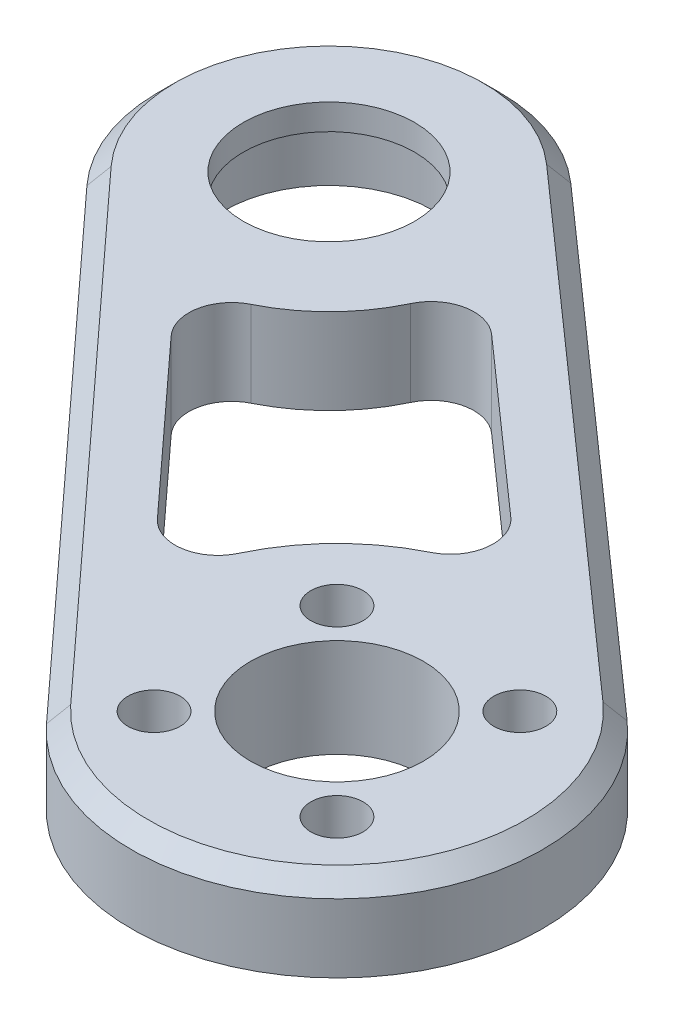
ISO-10303-21;
HEADER;
FILE_DESCRIPTION(('STEP AP214'),'2;1');
FILE_NAME('part.step','',(''),(''),'','','');
FILE_SCHEMA(('AUTOMOTIVE_DESIGN { 1 0 10303 214 1 1 1 1 }'));
ENDSEC;
DATA;
#1=APPLICATION_CONTEXT('core data for automotive mechanical design processes');
#2=APPLICATION_PROTOCOL_DEFINITION('international standard','automotive_design',2000,#1);
#3=PRODUCT_CONTEXT('',#1,'mechanical');
#4=PRODUCT('Part','Part','',(#3));
#5=PRODUCT_RELATED_PRODUCT_CATEGORY('part','',(#4));
#6=PRODUCT_DEFINITION_FORMATION('','',#4);
#7=PRODUCT_DEFINITION_CONTEXT('part definition',#1,'design');
#8=PRODUCT_DEFINITION('design','',#6,#7);
#9=PRODUCT_DEFINITION_SHAPE('','',#8);
#10=(LENGTH_UNIT() NAMED_UNIT(*) SI_UNIT(.MILLI.,.METRE.));
#11=(NAMED_UNIT(*) PLANE_ANGLE_UNIT() SI_UNIT($,.RADIAN.));
#12=(NAMED_UNIT(*) SI_UNIT($,.STERADIAN.) SOLID_ANGLE_UNIT());
#13=UNCERTAINTY_MEASURE_WITH_UNIT(LENGTH_MEASURE(1.E-05),#10,'distance_accuracy_value','');
#14=(GEOMETRIC_REPRESENTATION_CONTEXT(3) GLOBAL_UNCERTAINTY_ASSIGNED_CONTEXT((#13)) GLOBAL_UNIT_ASSIGNED_CONTEXT((#10,
#11,#12)) REPRESENTATION_CONTEXT('',''));
#15=CARTESIAN_POINT('',(0.,0.,0.));
#16=DIRECTION('',(0.,0.,1.));
#17=DIRECTION('',(1.,0.,0.));
#18=AXIS2_PLACEMENT_3D('',#15,#16,#17);
#19=CARTESIAN_POINT('',(-55.,10.,-54.067232451828));
#20=DIRECTION('',(0.,-1.,0.));
#21=DIRECTION('',(0.,0.,-1.));
#22=AXIS2_PLACEMENT_3D('',#19,#20,#21);
#23=CYLINDRICAL_SURFACE('',#22,10.);
#24=CARTESIAN_POINT('',(-55.,10.,-54.067232451828));
#25=DIRECTION('',(0.,1.,0.));
#26=DIRECTION('',(0.,0.,1.));
#27=AXIS2_PLACEMENT_3D('',#24,#25,#26);
#28=CIRCLE('',#27,10.);
#29=CARTESIAN_POINT('',(-55.,10.,-44.067232451828));
#30=VERTEX_POINT('',#29);
#31=EDGE_CURVE('E172',#30,#30,#28,.T.);
#32=ORIENTED_EDGE('',*,*,#31,.T.);
#33=EDGE_LOOP('',(#32));
#34=FACE_BOUND('',#33,.T.);
#35=CARTESIAN_POINT('',(-55.,7.,-54.067232451828));
#36=DIRECTION('',(0.,-1.,0.));
#37=DIRECTION('',(0.,0.,-1.));
#38=AXIS2_PLACEMENT_3D('',#35,#36,#37);
#39=CIRCLE('',#38,10.);
#40=CARTESIAN_POINT('',(-55.,7.,-64.067232451828));
#41=VERTEX_POINT('',#40);
#42=EDGE_CURVE('E201',#41,#41,#39,.T.);
#43=ORIENTED_EDGE('',*,*,#42,.T.);
#44=EDGE_LOOP('',(#43));
#45=FACE_BOUND('',#44,.T.);
#46=ADVANCED_FACE('F50',(#34,#45),#23,.F.);
#47=CARTESIAN_POINT('',(-55.,10.,-54.067232451828));
#48=DIRECTION('',(0.,-1.,0.));
#49=DIRECTION('',(0.,0.,-1.));
#50=AXIS2_PLACEMENT_3D('',#47,#48,#49);
#51=PLANE('',#50);
#52=DIRECTION('',(0.675809968436696,0.,0.737075902849626));
#53=VECTOR('',#52,1.);
#54=CARTESIAN_POINT('',(-68.2673662512933,10.,-41.9026530199674));
#55=LINE('',#54,#53);
#56=CARTESIAN_POINT('',(-68.2673662512933,10.,-41.9026530199674));
#57=VERTEX_POINT('',#56);
#58=CARTESIAN_POINT('',(-16.2156698626918,10.,14.8678193056074));
#59=VERTEX_POINT('',#58);
#60=EDGE_CURVE('E292',#57,#59,#55,.T.);
#61=ORIENTED_EDGE('',*,*,#60,.T.);
#62=CARTESIAN_POINT('',(0.,10.,0.));
#63=DIRECTION('',(0.,-1.,0.));
#64=DIRECTION('',(0.,0.,-1.));
#65=AXIS2_PLACEMENT_3D('',#62,#63,#64);
#66=CIRCLE('',#65,22.0000000000001);
#67=CARTESIAN_POINT('',(14.5883047431323,10.,-16.4675852729387));
#68=VERTEX_POINT('',#67);
#69=EDGE_CURVE('E300',#59,#68,#66,.F.);
#70=ORIENTED_EDGE('',*,*,#69,.T.);
#71=DIRECTION('',(-0.748526603315393,0.,-0.663104761051465));
#72=VECTOR('',#71,1.);
#73=CARTESIAN_POINT('',(-43.0641143010736,10.,-67.5407113115051));
#74=LINE('',#73,#72);
#75=CARTESIAN_POINT('',(-43.0641143010736,10.,-67.5407113115051));
#76=VERTEX_POINT('',#75);
#77=EDGE_CURVE('E294',#68,#76,#74,.T.);
#78=ORIENTED_EDGE('',*,*,#77,.T.);
#79=CARTESIAN_POINT('',(-55.,10.,-54.067232451828));
#80=DIRECTION('',(0.,-1.,0.));
#81=DIRECTION('',(0.,0.,-1.));
#82=AXIS2_PLACEMENT_3D('',#79,#80,#81);
#83=CIRCLE('',#82,18.);
#84=EDGE_CURVE('E286',#76,#57,#83,.F.);
#85=ORIENTED_EDGE('',*,*,#84,.T.);
#86=EDGE_LOOP('',(#61,#70,#78,#85));
#87=FACE_BOUND('',#86,.T.);
#88=CARTESIAN_POINT('',(-10.677312395917,10.,-10.6773123959167));
#89=DIRECTION('',(0.,-1.,0.));
#90=DIRECTION('',(0.,0.,-1.));
#91=AXIS2_PLACEMENT_3D('',#88,#89,#90);
#92=CIRCLE('',#91,3.05);
#93=CARTESIAN_POINT('',(-10.677312395917,10.,-13.7273123959167));
#94=VERTEX_POINT('',#93);
#95=EDGE_CURVE('E322',#94,#94,#92,.T.);
#96=ORIENTED_EDGE('',*,*,#95,.T.);
#97=EDGE_LOOP('',(#96));
#98=FACE_BOUND('',#97,.T.);
#99=CARTESIAN_POINT('',(10.6773123959168,10.,-10.677312395917));
#100=DIRECTION('',(0.,-1.,0.));
#101=DIRECTION('',(0.,0.,-1.));
#102=AXIS2_PLACEMENT_3D('',#99,#100,#101);
#103=CIRCLE('',#102,3.05);
#104=CARTESIAN_POINT('',(10.6773123959168,10.,-13.727312395917));
#105=VERTEX_POINT('',#104);
#106=EDGE_CURVE('E337',#105,#105,#103,.T.);
#107=ORIENTED_EDGE('',*,*,#106,.T.);
#108=EDGE_LOOP('',(#107));
#109=FACE_BOUND('',#108,.T.);
#110=CARTESIAN_POINT('',(10.6773123959169,10.,10.6773123959168));
#111=DIRECTION('',(0.,-1.,0.));
#112=DIRECTION('',(0.,0.,-1.));
#113=AXIS2_PLACEMENT_3D('',#110,#111,#112);
#114=CIRCLE('',#113,3.05);
#115=CARTESIAN_POINT('',(10.6773123959169,10.,7.62731239591681));
#116=VERTEX_POINT('',#115);
#117=EDGE_CURVE('E482',#116,#116,#114,.T.);
#118=ORIENTED_EDGE('',*,*,#117,.T.);
#119=EDGE_LOOP('',(#118));
#120=FACE_BOUND('',#119,.T.);
#121=CARTESIAN_POINT('',(-10.6773123959169,10.,10.6773123959169));
#122=DIRECTION('',(0.,-1.,0.));
#123=DIRECTION('',(0.,0.,-1.));
#124=AXIS2_PLACEMENT_3D('',#121,#122,#123);
#125=CIRCLE('',#124,3.05);
#126=CARTESIAN_POINT('',(-10.6773123959169,10.,7.62731239591688));
#127=VERTEX_POINT('',#126);
#128=EDGE_CURVE('E336',#127,#127,#125,.T.);
#129=ORIENTED_EDGE('',*,*,#128,.T.);
#130=EDGE_LOOP('',(#129));
#131=FACE_BOUND('',#130,.T.);
#132=ORIENTED_EDGE('',*,*,#31,.F.);
#133=EDGE_LOOP('',(#132));
#134=FACE_BOUND('',#133,.T.);
#135=CARTESIAN_POINT('',(0.,10.,0.));
#136=DIRECTION('',(0.,1.,0.));
#137=DIRECTION('',(0.,0.,1.));
#138=AXIS2_PLACEMENT_3D('',#135,#136,#137);
#139=CIRCLE('',#138,10.1);
#140=CARTESIAN_POINT('',(0.,10.,10.1));
#141=VERTEX_POINT('',#140);
#142=EDGE_CURVE('E253',#141,#141,#139,.T.);
#143=ORIENTED_EDGE('',*,*,#142,.F.);
#144=EDGE_LOOP('',(#143));
#145=FACE_BOUND('',#144,.T.);
#146=CARTESIAN_POINT('',(-26.2417192829032,10.,-12.3439122273819));
#147=DIRECTION('',(0.,1.,0.));
#148=DIRECTION('',(0.,0.,1.));
#149=AXIS2_PLACEMENT_3D('',#146,#147,#148);
#150=CIRCLE('',#149,5.);
#151=CARTESIAN_POINT('',(-29.9270987971513,10.,-8.96486238519837));
#152=VERTEX_POINT('',#151);
#153=CARTESIAN_POINT('',(-21.7172849237819,10.,-10.2156514985229));
#154=VERTEX_POINT('',#153);
#155=EDGE_CURVE('E151',#152,#154,#150,.T.);
#156=ORIENTED_EDGE('',*,*,#155,.F.);
#157=DIRECTION('',(0.675809968436696,0.,0.737075902849626));
#158=VECTOR('',#157,1.);
#159=CARTESIAN_POINT('',(-47.6254715917148,10.,-28.2676911621966));
#160=LINE('',#159,#158);
#161=CARTESIAN_POINT('',(-47.6254715917148,10.,-28.2676911621966));
#162=VERTEX_POINT('',#161);
#163=EDGE_CURVE('E197',#162,#152,#160,.T.);
#164=ORIENTED_EDGE('',*,*,#163,.F.);
#165=CARTESIAN_POINT('',(-43.9400920774667,10.,-31.6467410043801));
#166=DIRECTION('',(0.,1.,0.));
#167=DIRECTION('',(0.,0.,-1.));
#168=AXIS2_PLACEMENT_3D('',#165,#166,#167);
#169=CIRCLE('',#168,5.);
#170=CARTESIAN_POINT('',(-46.1520736619733,10.,-36.1308392938697));
#171=VERTEX_POINT('',#170);
#172=EDGE_CURVE('E191',#171,#162,#169,.T.);
#173=ORIENTED_EDGE('',*,*,#172,.F.);
#174=CARTESIAN_POINT('',(-55.0000000000002,10.,-54.0672324518282));
#175=DIRECTION('',(0.,-1.,0.));
#176=DIRECTION('',(0.,0.,1.));
#177=AXIS2_PLACEMENT_3D('',#174,#175,#176);
#178=CIRCLE('',#177,20.0000000000003);
#179=CARTESIAN_POINT('',(-36.9149025544563,10.,-45.527370018206));
#180=VERTEX_POINT('',#179);
#181=EDGE_CURVE('E186',#180,#171,#178,.T.);
#182=ORIENTED_EDGE('',*,*,#181,.F.);
#183=CARTESIAN_POINT('',(-32.3936281930703,10.,-43.3924044098006));
#184=DIRECTION('',(0.,1.,0.));
#185=DIRECTION('',(0.,0.,1.));
#186=AXIS2_PLACEMENT_3D('',#183,#184,#185);
#187=CIRCLE('',#186,5.);
#188=CARTESIAN_POINT('',(-29.078104387813,10.,-47.1350374263775));
#189=VERTEX_POINT('',#188);
#190=EDGE_CURVE('E190',#189,#180,#187,.T.);
#191=ORIENTED_EDGE('',*,*,#190,.F.);
#192=DIRECTION('',(-0.748526603315393,0.,-0.663104761051465));
#193=VECTOR('',#192,1.);
#194=CARTESIAN_POINT('',(-29.078104387813,10.,-47.1350374263775));
#195=LINE('',#194,#193);
#196=CARTESIAN_POINT('',(-9.47540023893942,10.,-29.7693935160243));
#197=VERTEX_POINT('',#196);
#198=EDGE_CURVE('E182',#197,#189,#195,.T.);
#199=ORIENTED_EDGE('',*,*,#198,.F.);
#200=CARTESIAN_POINT('',(-12.7909240441967,10.,-26.0267604994473));
#201=DIRECTION('',(0.,1.,0.));
#202=DIRECTION('',(0.,0.,-1.));
#203=AXIS2_PLACEMENT_3D('',#200,#201,#202);
#204=CIRCLE('',#203,5.);
#205=CARTESIAN_POINT('',(-10.5855923124387,10.,-21.5393879995426));
#206=VERTEX_POINT('',#205);
#207=EDGE_CURVE('E180',#206,#197,#204,.T.);
#208=ORIENTED_EDGE('',*,*,#207,.F.);
#209=CARTESIAN_POINT('',(8.96852037080009E-13,10.,8.77770078844264E-13));
#210=DIRECTION('',(0.,-1.,0.));
#211=DIRECTION('',(0.,0.,-1.));
#212=AXIS2_PLACEMENT_3D('',#209,#210,#211);
#213=CIRCLE('',#212,24.0000000000012);
#214=EDGE_CURVE('E165',#154,#206,#213,.T.);
#215=ORIENTED_EDGE('',*,*,#214,.F.);
#216=EDGE_LOOP('',(#156,#164,#173,#182,#191,#199,#208,#215));
#217=FACE_BOUND('',#216,.T.);
#218=ADVANCED_FACE('F171',(#87,#98,#109,#120,#131,#134,#145,#217),#51,.F.);
#219=CARTESIAN_POINT('',(-55.,0.,-54.067232451828));
#220=DIRECTION('',(0.,-1.,0.));
#221=DIRECTION('',(0.,0.,-1.));
#222=AXIS2_PLACEMENT_3D('',#219,#220,#221);
#223=PLANE('',#222);
#224=CARTESIAN_POINT('',(0.,0.,0.));
#225=DIRECTION('',(0.,-1.,0.));
#226=DIRECTION('',(0.,0.,-1.));
#227=AXIS2_PLACEMENT_3D('',#224,#225,#226);
#228=CIRCLE('',#227,21.5);
#229=CARTESIAN_POINT('',(0.,0.,-21.5));
#230=VERTEX_POINT('',#229);
#231=EDGE_CURVE('E283',#230,#230,#228,.T.);
#232=ORIENTED_EDGE('',*,*,#231,.F.);
#233=EDGE_LOOP('',(#232));
#234=FACE_BOUND('',#233,.T.);
#235=CARTESIAN_POINT('',(-55.,0.,-54.067232451828));
#236=DIRECTION('',(0.,-1.,0.));
#237=DIRECTION('',(0.,0.,-1.));
#238=AXIS2_PLACEMENT_3D('',#235,#236,#237);
#239=CIRCLE('',#238,12.2);
#240=CARTESIAN_POINT('',(-55.,0.,-66.267232451828));
#241=VERTEX_POINT('',#240);
#242=EDGE_CURVE('E360',#241,#241,#239,.T.);
#243=ORIENTED_EDGE('',*,*,#242,.F.);
#244=EDGE_LOOP('',(#243));
#245=FACE_BOUND('',#244,.T.);
#246=CARTESIAN_POINT('',(-55.,0.,-54.067232451828));
#247=DIRECTION('',(0.,1.,0.));
#248=DIRECTION('',(0.,0.,-1.));
#249=AXIS2_PLACEMENT_3D('',#246,#247,#248);
#250=CIRCLE('',#249,20.);
#251=CARTESIAN_POINT('',(-41.7379047789707,0.,-69.0377645181358));
#252=VERTEX_POINT('',#251);
#253=CARTESIAN_POINT('',(-69.7415180569925,0.,-40.5510330830941));
#254=VERTEX_POINT('',#253);
#255=EDGE_CURVE('E254',#252,#254,#250,.T.);
#256=ORIENTED_EDGE('',*,*,#255,.F.);
#257=DIRECTION('',(-0.748526603315393,0.,-0.663104761051465));
#258=VECTOR('',#257,1.);
#259=CARTESIAN_POINT('',(-41.7379047789707,0.,-69.0377645181358));
#260=LINE('',#259,#258);
#261=CARTESIAN_POINT('',(15.9145142652352,0.,-17.9646384795694));
#262=VERTEX_POINT('',#261);
#263=EDGE_CURVE('E270',#262,#252,#260,.T.);
#264=ORIENTED_EDGE('',*,*,#263,.F.);
#265=CARTESIAN_POINT('',(0.,0.,0.));
#266=DIRECTION('',(0.,1.,0.));
#267=DIRECTION('',(0.,0.,1.));
#268=AXIS2_PLACEMENT_3D('',#265,#266,#267);
#269=CIRCLE('',#268,24.);
#270=CARTESIAN_POINT('',(-17.689821668391,0.,16.2194392424807));
#271=VERTEX_POINT('',#270);
#272=EDGE_CURVE('E263',#271,#262,#269,.T.);
#273=ORIENTED_EDGE('',*,*,#272,.F.);
#274=DIRECTION('',(0.675809968436696,0.,0.737075902849626));
#275=VECTOR('',#274,1.);
#276=CARTESIAN_POINT('',(-69.7415180569925,0.,-40.5510330830941));
#277=LINE('',#276,#275);
#278=EDGE_CURVE('E259',#254,#271,#277,.T.);
#279=ORIENTED_EDGE('',*,*,#278,.F.);
#280=EDGE_LOOP('',(#256,#264,#273,#279));
#281=FACE_BOUND('',#280,.T.);
#282=DIRECTION('',(0.675809968436696,0.,0.737075902849626));
#283=VECTOR('',#282,1.);
#284=CARTESIAN_POINT('',(-47.6254715917148,0.,-28.2676911621966));
#285=LINE('',#284,#283);
#286=CARTESIAN_POINT('',(-47.6254715917148,0.,-28.2676911621966));
#287=VERTEX_POINT('',#286);
#288=CARTESIAN_POINT('',(-29.9270987971513,0.,-8.96486238519838));
#289=VERTEX_POINT('',#288);
#290=EDGE_CURVE('E162',#287,#289,#285,.T.);
#291=ORIENTED_EDGE('',*,*,#290,.T.);
#292=CARTESIAN_POINT('',(-26.2417192829032,0.,-12.3439122273819));
#293=DIRECTION('',(0.,1.,0.));
#294=DIRECTION('',(0.,0.,1.));
#295=AXIS2_PLACEMENT_3D('',#292,#293,#294);
#296=CIRCLE('',#295,5.);
#297=CARTESIAN_POINT('',(-21.7172849237819,0.,-10.2156514985229));
#298=VERTEX_POINT('',#297);
#299=EDGE_CURVE('E199',#289,#298,#296,.T.);
#300=ORIENTED_EDGE('',*,*,#299,.T.);
#301=CARTESIAN_POINT('',(8.96852037080009E-13,0.,8.77770078844264E-13));
#302=DIRECTION('',(0.,-1.,0.));
#303=DIRECTION('',(0.,0.,-1.));
#304=AXIS2_PLACEMENT_3D('',#301,#302,#303);
#305=CIRCLE('',#304,24.0000000000012);
#306=CARTESIAN_POINT('',(-10.5855923124387,0.,-21.5393879995426));
#307=VERTEX_POINT('',#306);
#308=EDGE_CURVE('E166',#298,#307,#305,.T.);
#309=ORIENTED_EDGE('',*,*,#308,.T.);
#310=CARTESIAN_POINT('',(-12.7909240441967,0.,-26.0267604994473));
#311=DIRECTION('',(0.,1.,0.));
#312=DIRECTION('',(0.,0.,-1.));
#313=AXIS2_PLACEMENT_3D('',#310,#311,#312);
#314=CIRCLE('',#313,5.);
#315=CARTESIAN_POINT('',(-9.47540023893942,0.,-29.7693935160243));
#316=VERTEX_POINT('',#315);
#317=EDGE_CURVE('E206',#307,#316,#314,.T.);
#318=ORIENTED_EDGE('',*,*,#317,.T.);
#319=DIRECTION('',(-0.748526603315393,0.,-0.663104761051465));
#320=VECTOR('',#319,1.);
#321=CARTESIAN_POINT('',(-29.078104387813,0.,-47.1350374263775));
#322=LINE('',#321,#320);
#323=CARTESIAN_POINT('',(-29.078104387813,0.,-47.1350374263775));
#324=VERTEX_POINT('',#323);
#325=EDGE_CURVE('E209',#316,#324,#322,.T.);
#326=ORIENTED_EDGE('',*,*,#325,.T.);
#327=CARTESIAN_POINT('',(-32.3936281930703,0.,-43.3924044098006));
#328=DIRECTION('',(0.,1.,0.));
#329=DIRECTION('',(0.,0.,1.));
#330=AXIS2_PLACEMENT_3D('',#327,#328,#329);
#331=CIRCLE('',#330,5.);
#332=CARTESIAN_POINT('',(-36.9149025544563,0.,-45.527370018206));
#333=VERTEX_POINT('',#332);
#334=EDGE_CURVE('E212',#324,#333,#331,.T.);
#335=ORIENTED_EDGE('',*,*,#334,.T.);
#336=CARTESIAN_POINT('',(-55.0000000000002,0.,-54.0672324518282));
#337=DIRECTION('',(0.,-1.,0.));
#338=DIRECTION('',(0.,0.,1.));
#339=AXIS2_PLACEMENT_3D('',#336,#337,#338);
#340=CIRCLE('',#339,20.0000000000003);
#341=CARTESIAN_POINT('',(-46.1520736619733,0.,-36.1308392938697));
#342=VERTEX_POINT('',#341);
#343=EDGE_CURVE('E217',#333,#342,#340,.T.);
#344=ORIENTED_EDGE('',*,*,#343,.T.);
#345=CARTESIAN_POINT('',(-43.9400920774667,0.,-31.6467410043801));
#346=DIRECTION('',(0.,1.,0.));
#347=DIRECTION('',(0.,0.,-1.));
#348=AXIS2_PLACEMENT_3D('',#345,#346,#347);
#349=CIRCLE('',#348,5.);
#350=EDGE_CURVE('E225',#342,#287,#349,.T.);
#351=ORIENTED_EDGE('',*,*,#350,.T.);
#352=EDGE_LOOP('',(#291,#300,#309,#318,#326,#335,#344,#351));
#353=FACE_BOUND('',#352,.T.);
#354=ADVANCED_FACE('F369',(#234,#245,#281,#353),#223,.T.);
#355=CARTESIAN_POINT('',(-55.,10.,-54.067232451828));
#356=DIRECTION('',(0.,-1.,0.));
#357=DIRECTION('',(0.,0.,-1.));
#358=AXIS2_PLACEMENT_3D('',#355,#356,#357);
#359=CYLINDRICAL_SURFACE('',#358,20.);
#360=DIRECTION('',(0.,-1.,0.));
#361=VECTOR('',#360,1.);
#362=CARTESIAN_POINT('',(-69.7415180569925,10.,-40.5510330830941));
#363=LINE('',#362,#361);
#364=CARTESIAN_POINT('',(-69.7415180569925,8.00000000000005,-40.5510330830941));
#365=VERTEX_POINT('',#364);
#366=EDGE_CURVE('E278',#365,#254,#363,.T.);
#367=ORIENTED_EDGE('',*,*,#366,.F.);
#368=CARTESIAN_POINT('',(-55.,8.00000000000005,-54.067232451828));
#369=DIRECTION('',(0.,-1.,0.));
#370=DIRECTION('',(0.,0.,-1.));
#371=AXIS2_PLACEMENT_3D('',#368,#369,#370);
#372=CIRCLE('',#371,20.);
#373=CARTESIAN_POINT('',(-41.7379047789707,8.00000000000005,-69.0377645181358));
#374=VERTEX_POINT('',#373);
#375=EDGE_CURVE('E11',#365,#374,#372,.T.);
#376=ORIENTED_EDGE('',*,*,#375,.T.);
#377=DIRECTION('',(0.,-1.,0.));
#378=VECTOR('',#377,1.);
#379=CARTESIAN_POINT('',(-41.7379047789707,10.,-69.0377645181358));
#380=LINE('',#379,#378);
#381=EDGE_CURVE('E271',#374,#252,#380,.T.);
#382=ORIENTED_EDGE('',*,*,#381,.T.);
#383=ORIENTED_EDGE('',*,*,#255,.T.);
#384=EDGE_LOOP('',(#367,#376,#382,#383));
#385=FACE_BOUND('',#384,.T.);
#386=ADVANCED_FACE('F375',(#385),#359,.T.);
#387=CARTESIAN_POINT('',(-69.7415180569925,10.,-40.5510330830941));
#388=DIRECTION('',(0.737075902849626,0.,-0.675809968436696));
#389=DIRECTION('',(-0.675809968436696,0.,-0.737075902849626));
#390=AXIS2_PLACEMENT_3D('',#387,#388,#389);
#391=PLANE('',#390);
#392=DIRECTION('',(0.,-1.,0.));
#393=VECTOR('',#392,1.);
#394=CARTESIAN_POINT('',(-17.689821668391,10.,16.2194392424807));
#395=LINE('',#394,#393);
#396=CARTESIAN_POINT('',(-17.689821668391,8.00000000000005,16.2194392424807));
#397=VERTEX_POINT('',#396);
#398=EDGE_CURVE('E280',#397,#271,#395,.T.);
#399=ORIENTED_EDGE('',*,*,#398,.F.);
#400=DIRECTION('',(-0.675809968436696,0.,-0.737075902849626));
#401=VECTOR('',#400,1.);
#402=CARTESIAN_POINT('',(-69.7415180569925,8.00000000000005,-40.5510330830941));
#403=LINE('',#402,#401);
#404=EDGE_CURVE('E59',#397,#365,#403,.T.);
#405=ORIENTED_EDGE('',*,*,#404,.T.);
#406=ORIENTED_EDGE('',*,*,#366,.T.);
#407=ORIENTED_EDGE('',*,*,#278,.T.);
#408=EDGE_LOOP('',(#399,#405,#406,#407));
#409=FACE_BOUND('',#408,.T.);
#410=ADVANCED_FACE('F436',(#409),#391,.F.);
#411=CARTESIAN_POINT('',(0.,10.,0.));
#412=DIRECTION('',(0.,-1.,0.));
#413=DIRECTION('',(0.,0.,-1.));
#414=AXIS2_PLACEMENT_3D('',#411,#412,#413);
#415=CYLINDRICAL_SURFACE('',#414,24.);
#416=DIRECTION('',(0.,-1.,0.));
#417=VECTOR('',#416,1.);
#418=CARTESIAN_POINT('',(15.9145142652352,10.,-17.9646384795694));
#419=LINE('',#418,#417);
#420=CARTESIAN_POINT('',(15.9145142652352,8.00000000000005,-17.9646384795694));
#421=VERTEX_POINT('',#420);
#422=EDGE_CURVE('E273',#421,#262,#419,.T.);
#423=ORIENTED_EDGE('',*,*,#422,.F.);
#424=CARTESIAN_POINT('',(0.,8.00000000000005,0.));
#425=DIRECTION('',(0.,-1.,0.));
#426=DIRECTION('',(0.,0.,-1.));
#427=AXIS2_PLACEMENT_3D('',#424,#425,#426);
#428=CIRCLE('',#427,24.);
#429=EDGE_CURVE('E303',#421,#397,#428,.T.);
#430=ORIENTED_EDGE('',*,*,#429,.T.);
#431=ORIENTED_EDGE('',*,*,#398,.T.);
#432=ORIENTED_EDGE('',*,*,#272,.T.);
#433=EDGE_LOOP('',(#423,#430,#431,#432));
#434=FACE_BOUND('',#433,.T.);
#435=ADVANCED_FACE('F435',(#434),#415,.T.);
#436=CARTESIAN_POINT('',(-41.7379047789707,10.,-69.0377645181358));
#437=DIRECTION('',(-0.663104761051465,0.,0.748526603315393));
#438=DIRECTION('',(0.748526603315393,0.,0.663104761051465));
#439=AXIS2_PLACEMENT_3D('',#436,#437,#438);
#440=PLANE('',#439);
#441=ORIENTED_EDGE('',*,*,#381,.F.);
#442=DIRECTION('',(0.748526603315393,0.,0.663104761051465));
#443=VECTOR('',#442,1.);
#444=CARTESIAN_POINT('',(-41.7379047789707,8.00000000000005,-69.0377645181358));
#445=LINE('',#444,#443);
#446=EDGE_CURVE('E304',#374,#421,#445,.T.);
#447=ORIENTED_EDGE('',*,*,#446,.T.);
#448=ORIENTED_EDGE('',*,*,#422,.T.);
#449=ORIENTED_EDGE('',*,*,#263,.T.);
#450=EDGE_LOOP('',(#441,#447,#448,#449));
#451=FACE_BOUND('',#450,.T.);
#452=ADVANCED_FACE('F430',(#451),#440,.F.);
#453=CARTESIAN_POINT('',(0.,10.,0.));
#454=DIRECTION('',(0.,-1.,0.));
#455=DIRECTION('',(0.,0.,-1.));
#456=AXIS2_PLACEMENT_3D('',#453,#454,#455);
#457=CYLINDRICAL_SURFACE('',#456,10.1);
#458=ORIENTED_EDGE('',*,*,#142,.T.);
#459=EDGE_LOOP('',(#458));
#460=FACE_BOUND('',#459,.T.);
#461=CARTESIAN_POINT('',(0.,-1.5,0.));
#462=DIRECTION('',(0.,-1.,0.));
#463=DIRECTION('',(0.,0.,-1.));
#464=AXIS2_PLACEMENT_3D('',#461,#462,#463);
#465=CIRCLE('',#464,10.1);
#466=CARTESIAN_POINT('',(0.,-1.5,-10.1));
#467=VERTEX_POINT('',#466);
#468=EDGE_CURVE('E342',#467,#467,#465,.T.);
#469=ORIENTED_EDGE('',*,*,#468,.T.);
#470=EDGE_LOOP('',(#469));
#471=FACE_BOUND('',#470,.T.);
#472=ADVANCED_FACE('F422',(#460,#471),#457,.F.);
#473=CARTESIAN_POINT('',(-26.2417192829032,10.,-12.3439122273819));
#474=DIRECTION('',(0.,-1.,0.));
#475=DIRECTION('',(0.,0.,-1.));
#476=AXIS2_PLACEMENT_3D('',#473,#474,#475);
#477=CYLINDRICAL_SURFACE('',#476,5.);
#478=ORIENTED_EDGE('',*,*,#299,.F.);
#479=DIRECTION('',(0.,-1.,0.));
#480=VECTOR('',#479,1.);
#481=CARTESIAN_POINT('',(-29.9270987971513,10.,-8.96486238519837));
#482=LINE('',#481,#480);
#483=EDGE_CURVE('E160',#152,#289,#482,.T.);
#484=ORIENTED_EDGE('',*,*,#483,.F.);
#485=ORIENTED_EDGE('',*,*,#155,.T.);
#486=DIRECTION('',(0.,-1.,0.));
#487=VECTOR('',#486,1.);
#488=CARTESIAN_POINT('',(-21.7172849237819,10.,-10.2156514985229));
#489=LINE('',#488,#487);
#490=EDGE_CURVE('E152',#154,#298,#489,.T.);
#491=ORIENTED_EDGE('',*,*,#490,.T.);
#492=EDGE_LOOP('',(#478,#484,#485,#491));
#493=FACE_BOUND('',#492,.T.);
#494=ADVANCED_FACE('F153',(#493),#477,.F.);
#495=CARTESIAN_POINT('',(8.96852037080009E-13,10.,8.77770078844264E-13));
#496=DIRECTION('',(0.,-1.,0.));
#497=DIRECTION('',(0.,0.,-1.));
#498=AXIS2_PLACEMENT_3D('',#495,#496,#497);
#499=CYLINDRICAL_SURFACE('',#498,24.0000000000012);
#500=ORIENTED_EDGE('',*,*,#308,.F.);
#501=ORIENTED_EDGE('',*,*,#490,.F.);
#502=ORIENTED_EDGE('',*,*,#214,.T.);
#503=DIRECTION('',(0.,-1.,0.));
#504=VECTOR('',#503,1.);
#505=CARTESIAN_POINT('',(-10.5855923124387,10.,-21.5393879995426));
#506=LINE('',#505,#504);
#507=EDGE_CURVE('E175',#206,#307,#506,.T.);
#508=ORIENTED_EDGE('',*,*,#507,.T.);
#509=EDGE_LOOP('',(#500,#501,#502,#508));
#510=FACE_BOUND('',#509,.T.);
#511=ADVANCED_FACE('F167',(#510),#499,.T.);
#512=CARTESIAN_POINT('',(-12.7909240441967,10.,-26.0267604994473));
#513=DIRECTION('',(0.,-1.,0.));
#514=DIRECTION('',(0.,0.,-1.));
#515=AXIS2_PLACEMENT_3D('',#512,#513,#514);
#516=CYLINDRICAL_SURFACE('',#515,5.);
#517=ORIENTED_EDGE('',*,*,#317,.F.);
#518=ORIENTED_EDGE('',*,*,#507,.F.);
#519=ORIENTED_EDGE('',*,*,#207,.T.);
#520=DIRECTION('',(0.,-1.,0.));
#521=VECTOR('',#520,1.);
#522=CARTESIAN_POINT('',(-9.47540023893942,10.,-29.7693935160243));
#523=LINE('',#522,#521);
#524=EDGE_CURVE('E243',#197,#316,#523,.T.);
#525=ORIENTED_EDGE('',*,*,#524,.T.);
#526=EDGE_LOOP('',(#517,#518,#519,#525));
#527=FACE_BOUND('',#526,.T.);
#528=ADVANCED_FACE('F401',(#527),#516,.F.);
#529=CARTESIAN_POINT('',(-29.078104387813,10.,-47.1350374263775));
#530=DIRECTION('',(-0.663104761051465,0.,0.748526603315393));
#531=DIRECTION('',(0.748526603315393,0.,0.663104761051465));
#532=AXIS2_PLACEMENT_3D('',#529,#530,#531);
#533=PLANE('',#532);
#534=ORIENTED_EDGE('',*,*,#325,.F.);
#535=ORIENTED_EDGE('',*,*,#524,.F.);
#536=ORIENTED_EDGE('',*,*,#198,.T.);
#537=DIRECTION('',(0.,-1.,0.));
#538=VECTOR('',#537,1.);
#539=CARTESIAN_POINT('',(-29.078104387813,10.,-47.1350374263775));
#540=LINE('',#539,#538);
#541=EDGE_CURVE('E238',#189,#324,#540,.T.);
#542=ORIENTED_EDGE('',*,*,#541,.T.);
#543=EDGE_LOOP('',(#534,#535,#536,#542));
#544=FACE_BOUND('',#543,.T.);
#545=ADVANCED_FACE('F399',(#544),#533,.T.);
#546=CARTESIAN_POINT('',(-32.3936281930703,10.,-43.3924044098006));
#547=DIRECTION('',(0.,-1.,0.));
#548=DIRECTION('',(0.,0.,-1.));
#549=AXIS2_PLACEMENT_3D('',#546,#547,#548);
#550=CYLINDRICAL_SURFACE('',#549,5.);
#551=ORIENTED_EDGE('',*,*,#334,.F.);
#552=ORIENTED_EDGE('',*,*,#541,.F.);
#553=ORIENTED_EDGE('',*,*,#190,.T.);
#554=DIRECTION('',(0.,-1.,0.));
#555=VECTOR('',#554,1.);
#556=CARTESIAN_POINT('',(-36.9149025544563,10.,-45.527370018206));
#557=LINE('',#556,#555);
#558=EDGE_CURVE('E240',#180,#333,#557,.T.);
#559=ORIENTED_EDGE('',*,*,#558,.T.);
#560=EDGE_LOOP('',(#551,#552,#553,#559));
#561=FACE_BOUND('',#560,.T.);
#562=ADVANCED_FACE('F391',(#561),#550,.F.);
#563=CARTESIAN_POINT('',(-55.0000000000002,10.,-54.0672324518282));
#564=DIRECTION('',(0.,-1.,0.));
#565=DIRECTION('',(0.,0.,-1.));
#566=AXIS2_PLACEMENT_3D('',#563,#564,#565);
#567=CYLINDRICAL_SURFACE('',#566,20.0000000000003);
#568=ORIENTED_EDGE('',*,*,#343,.F.);
#569=ORIENTED_EDGE('',*,*,#558,.F.);
#570=ORIENTED_EDGE('',*,*,#181,.T.);
#571=DIRECTION('',(0.,-1.,0.));
#572=VECTOR('',#571,1.);
#573=CARTESIAN_POINT('',(-46.1520736619733,10.,-36.1308392938697));
#574=LINE('',#573,#572);
#575=EDGE_CURVE('E232',#171,#342,#574,.T.);
#576=ORIENTED_EDGE('',*,*,#575,.T.);
#577=EDGE_LOOP('',(#568,#569,#570,#576));
#578=FACE_BOUND('',#577,.T.);
#579=ADVANCED_FACE('F392',(#578),#567,.T.);
#580=CARTESIAN_POINT('',(-43.9400920774667,10.,-31.6467410043801));
#581=DIRECTION('',(0.,-1.,0.));
#582=DIRECTION('',(0.,0.,-1.));
#583=AXIS2_PLACEMENT_3D('',#580,#581,#582);
#584=CYLINDRICAL_SURFACE('',#583,5.);
#585=ORIENTED_EDGE('',*,*,#350,.F.);
#586=ORIENTED_EDGE('',*,*,#575,.F.);
#587=ORIENTED_EDGE('',*,*,#172,.T.);
#588=DIRECTION('',(0.,-1.,0.));
#589=VECTOR('',#588,1.);
#590=CARTESIAN_POINT('',(-47.6254715917148,10.,-28.2676911621966));
#591=LINE('',#590,#589);
#592=EDGE_CURVE('E233',#162,#287,#591,.T.);
#593=ORIENTED_EDGE('',*,*,#592,.T.);
#594=EDGE_LOOP('',(#585,#586,#587,#593));
#595=FACE_BOUND('',#594,.T.);
#596=ADVANCED_FACE('F389',(#595),#584,.F.);
#597=CARTESIAN_POINT('',(-47.6254715917148,10.,-28.2676911621966));
#598=DIRECTION('',(0.737075902849626,0.,-0.675809968436697));
#599=DIRECTION('',(-0.675809968436697,0.,-0.737075902849626));
#600=AXIS2_PLACEMENT_3D('',#597,#598,#599);
#601=PLANE('',#600);
#602=ORIENTED_EDGE('',*,*,#290,.F.);
#603=ORIENTED_EDGE('',*,*,#592,.F.);
#604=ORIENTED_EDGE('',*,*,#163,.T.);
#605=ORIENTED_EDGE('',*,*,#483,.T.);
#606=EDGE_LOOP('',(#602,#603,#604,#605));
#607=FACE_BOUND('',#606,.T.);
#608=ADVANCED_FACE('F385',(#607),#601,.T.);
#609=CARTESIAN_POINT('',(-55.,7.,-54.067232451828));
#610=DIRECTION('',(0.,-1.,0.));
#611=DIRECTION('',(0.,0.,-1.));
#612=AXIS2_PLACEMENT_3D('',#609,#610,#611);
#613=CYLINDRICAL_SURFACE('',#612,12.2);
#614=CARTESIAN_POINT('',(-55.,7.,-54.067232451828));
#615=DIRECTION('',(0.,-1.,0.));
#616=DIRECTION('',(0.,0.,-1.));
#617=AXIS2_PLACEMENT_3D('',#614,#615,#616);
#618=CIRCLE('',#617,12.2);
#619=CARTESIAN_POINT('',(-55.,7.,-66.267232451828));
#620=VERTEX_POINT('',#619);
#621=EDGE_CURVE('E290',#620,#620,#618,.T.);
#622=ORIENTED_EDGE('',*,*,#621,.F.);
#623=EDGE_LOOP('',(#622));
#624=FACE_BOUND('',#623,.T.);
#625=ORIENTED_EDGE('',*,*,#242,.T.);
#626=EDGE_LOOP('',(#625));
#627=FACE_BOUND('',#626,.T.);
#628=ADVANCED_FACE('F370',(#624,#627),#613,.F.);
#629=CARTESIAN_POINT('',(-55.,7.,-54.067232451828));
#630=DIRECTION('',(0.,-1.,0.));
#631=DIRECTION('',(0.,0.,-1.));
#632=AXIS2_PLACEMENT_3D('',#629,#630,#631);
#633=PLANE('',#632);
#634=ORIENTED_EDGE('',*,*,#42,.F.);
#635=EDGE_LOOP('',(#634));
#636=FACE_BOUND('',#635,.T.);
#637=ORIENTED_EDGE('',*,*,#621,.T.);
#638=EDGE_LOOP('',(#637));
#639=FACE_BOUND('',#638,.T.);
#640=ADVANCED_FACE('F497',(#636,#639),#633,.T.);
#641=CARTESIAN_POINT('',(0.,-1.5,0.));
#642=DIRECTION('',(0.,-1.,0.));
#643=DIRECTION('',(0.,0.,-1.));
#644=AXIS2_PLACEMENT_3D('',#641,#642,#643);
#645=PLANE('',#644);
#646=CARTESIAN_POINT('',(-10.677312395917,-1.5,-10.6773123959167));
#647=DIRECTION('',(0.,-1.,0.));
#648=DIRECTION('',(0.,0.,-1.));
#649=AXIS2_PLACEMENT_3D('',#646,#647,#648);
#650=CIRCLE('',#649,3.05);
#651=CARTESIAN_POINT('',(-10.677312395917,-1.5,-13.7273123959167));
#652=VERTEX_POINT('',#651);
#653=EDGE_CURVE('E329',#652,#652,#650,.T.);
#654=ORIENTED_EDGE('',*,*,#653,.F.);
#655=EDGE_LOOP('',(#654));
#656=FACE_BOUND('',#655,.T.);
#657=CARTESIAN_POINT('',(10.6773123959168,-1.5,-10.677312395917));
#658=DIRECTION('',(0.,-1.,0.));
#659=DIRECTION('',(0.,0.,-1.));
#660=AXIS2_PLACEMENT_3D('',#657,#658,#659);
#661=CIRCLE('',#660,3.05);
#662=CARTESIAN_POINT('',(10.6773123959168,-1.5,-13.727312395917));
#663=VERTEX_POINT('',#662);
#664=EDGE_CURVE('E695',#663,#663,#661,.T.);
#665=ORIENTED_EDGE('',*,*,#664,.F.);
#666=EDGE_LOOP('',(#665));
#667=FACE_BOUND('',#666,.T.);
#668=CARTESIAN_POINT('',(10.6773123959169,-1.5,10.6773123959168));
#669=DIRECTION('',(0.,-1.,0.));
#670=DIRECTION('',(0.,0.,-1.));
#671=AXIS2_PLACEMENT_3D('',#668,#669,#670);
#672=CIRCLE('',#671,3.05);
#673=CARTESIAN_POINT('',(10.6773123959169,-1.5,7.62731239591681));
#674=VERTEX_POINT('',#673);
#675=EDGE_CURVE('E349',#674,#674,#672,.T.);
#676=ORIENTED_EDGE('',*,*,#675,.F.);
#677=EDGE_LOOP('',(#676));
#678=FACE_BOUND('',#677,.T.);
#679=CARTESIAN_POINT('',(-10.6773123959169,-1.5,10.6773123959169));
#680=DIRECTION('',(0.,-1.,0.));
#681=DIRECTION('',(0.,0.,-1.));
#682=AXIS2_PLACEMENT_3D('',#679,#680,#681);
#683=CIRCLE('',#682,3.05);
#684=CARTESIAN_POINT('',(-10.6773123959169,-1.5,7.62731239591688));
#685=VERTEX_POINT('',#684);
#686=EDGE_CURVE('E344',#685,#685,#683,.T.);
#687=ORIENTED_EDGE('',*,*,#686,.F.);
#688=EDGE_LOOP('',(#687));
#689=FACE_BOUND('',#688,.T.);
#690=CARTESIAN_POINT('',(0.,-1.5,0.));
#691=DIRECTION('',(0.,-1.,0.));
#692=DIRECTION('',(0.,0.,-1.));
#693=AXIS2_PLACEMENT_3D('',#690,#691,#692);
#694=CIRCLE('',#693,21.5);
#695=CARTESIAN_POINT('',(0.,-1.5,-21.5));
#696=VERTEX_POINT('',#695);
#697=EDGE_CURVE('E353',#696,#696,#694,.T.);
#698=ORIENTED_EDGE('',*,*,#697,.T.);
#699=EDGE_LOOP('',(#698));
#700=FACE_BOUND('',#699,.T.);
#701=ORIENTED_EDGE('',*,*,#468,.F.);
#702=EDGE_LOOP('',(#701));
#703=FACE_BOUND('',#702,.T.);
#704=ADVANCED_FACE('F492',(#656,#667,#678,#689,#700,#703),#645,.T.);
#705=CARTESIAN_POINT('',(0.,-1.5,0.));
#706=DIRECTION('',(0.,1.,0.));
#707=DIRECTION('',(0.,0.,1.));
#708=AXIS2_PLACEMENT_3D('',#705,#706,#707);
#709=CYLINDRICAL_SURFACE('',#708,21.5);
#710=ORIENTED_EDGE('',*,*,#697,.F.);
#711=EDGE_LOOP('',(#710));
#712=FACE_BOUND('',#711,.T.);
#713=ORIENTED_EDGE('',*,*,#231,.T.);
#714=EDGE_LOOP('',(#713));
#715=FACE_BOUND('',#714,.T.);
#716=ADVANCED_FACE('F494',(#712,#715),#709,.T.);
#717=CARTESIAN_POINT('',(-10.6773123959169,10.,10.6773123959169));
#718=DIRECTION('',(0.,-1.,0.));
#719=DIRECTION('',(0.,0.,-1.));
#720=AXIS2_PLACEMENT_3D('',#717,#718,#719);
#721=CYLINDRICAL_SURFACE('',#720,3.05);
#722=ORIENTED_EDGE('',*,*,#128,.F.);
#723=EDGE_LOOP('',(#722));
#724=FACE_BOUND('',#723,.T.);
#725=ORIENTED_EDGE('',*,*,#686,.T.);
#726=EDGE_LOOP('',(#725));
#727=FACE_BOUND('',#726,.T.);
#728=ADVANCED_FACE('F503',(#724,#727),#721,.F.);
#729=CARTESIAN_POINT('',(10.6773123959169,10.,10.6773123959168));
#730=DIRECTION('',(0.,-1.,0.));
#731=DIRECTION('',(0.,0.,-1.));
#732=AXIS2_PLACEMENT_3D('',#729,#730,#731);
#733=CYLINDRICAL_SURFACE('',#732,3.05);
#734=ORIENTED_EDGE('',*,*,#117,.F.);
#735=EDGE_LOOP('',(#734));
#736=FACE_BOUND('',#735,.T.);
#737=ORIENTED_EDGE('',*,*,#675,.T.);
#738=EDGE_LOOP('',(#737));
#739=FACE_BOUND('',#738,.T.);
#740=ADVANCED_FACE('F584',(#736,#739),#733,.F.);
#741=CARTESIAN_POINT('',(10.6773123959168,10.,-10.677312395917));
#742=DIRECTION('',(0.,-1.,0.));
#743=DIRECTION('',(0.,0.,-1.));
#744=AXIS2_PLACEMENT_3D('',#741,#742,#743);
#745=CYLINDRICAL_SURFACE('',#744,3.05);
#746=ORIENTED_EDGE('',*,*,#106,.F.);
#747=EDGE_LOOP('',(#746));
#748=FACE_BOUND('',#747,.T.);
#749=ORIENTED_EDGE('',*,*,#664,.T.);
#750=EDGE_LOOP('',(#749));
#751=FACE_BOUND('',#750,.T.);
#752=ADVANCED_FACE('F470',(#748,#751),#745,.F.);
#753=CARTESIAN_POINT('',(-10.677312395917,10.,-10.6773123959167));
#754=DIRECTION('',(0.,-1.,0.));
#755=DIRECTION('',(0.,0.,-1.));
#756=AXIS2_PLACEMENT_3D('',#753,#754,#755);
#757=CYLINDRICAL_SURFACE('',#756,3.05);
#758=ORIENTED_EDGE('',*,*,#95,.F.);
#759=EDGE_LOOP('',(#758));
#760=FACE_BOUND('',#759,.T.);
#761=ORIENTED_EDGE('',*,*,#653,.T.);
#762=EDGE_LOOP('',(#761));
#763=FACE_BOUND('',#762,.T.);
#764=ADVANCED_FACE('F465',(#760,#763),#757,.F.);
#765=CARTESIAN_POINT('',(-55.,10.,-54.067232451828));
#766=DIRECTION('',(0.,-1.,0.));
#767=DIRECTION('',(0.,0.,-1.));
#768=AXIS2_PLACEMENT_3D('',#765,#766,#767);
#769=CONICAL_SURFACE('',#768,18.,0.785398163397449);
#770=DIRECTION('',(-0.468885873176577,0.707106781186547,0.529288237102847));
#771=VECTOR('',#770,1.);
#772=CARTESIAN_POINT('',(-41.7379047789707,8.00000000000005,-69.0377645181358));
#773=LINE('',#772,#771);
#774=EDGE_CURVE('E312',#374,#76,#773,.T.);
#775=ORIENTED_EDGE('',*,*,#774,.F.);
#776=ORIENTED_EDGE('',*,*,#375,.F.);
#777=DIRECTION('',(-0.521191369154168,-0.707106781186546,0.477869811475056));
#778=VECTOR('',#777,1.);
#779=CARTESIAN_POINT('',(-68.2673662512933,10.,-41.9026530199674));
#780=LINE('',#779,#778);
#781=EDGE_CURVE('E55',#57,#365,#780,.T.);
#782=ORIENTED_EDGE('',*,*,#781,.F.);
#783=ORIENTED_EDGE('',*,*,#84,.F.);
#784=EDGE_LOOP('',(#775,#776,#782,#783));
#785=FACE_BOUND('',#784,.T.);
#786=ADVANCED_FACE('F49',(#785),#769,.T.);
#787=CARTESIAN_POINT('',(-68.2673662512933,10.,-41.9026530199674));
#788=DIRECTION('',(0.521191369154166,-0.70710678118655,-0.477869811475053));
#789=DIRECTION('',(0.675809968436696,0.,0.737075902849626));
#790=AXIS2_PLACEMENT_3D('',#787,#788,#789);
#791=PLANE('',#790);
#792=ORIENTED_EDGE('',*,*,#781,.T.);
#793=ORIENTED_EDGE('',*,*,#404,.F.);
#794=DIRECTION('',(-0.521191369154168,-0.707106781186546,0.477869811475055));
#795=VECTOR('',#794,1.);
#796=CARTESIAN_POINT('',(-16.2156698626918,10.,14.8678193056074));
#797=LINE('',#796,#795);
#798=EDGE_CURVE('E311',#59,#397,#797,.T.);
#799=ORIENTED_EDGE('',*,*,#798,.F.);
#800=ORIENTED_EDGE('',*,*,#60,.F.);
#801=EDGE_LOOP('',(#792,#793,#799,#800));
#802=FACE_BOUND('',#801,.T.);
#803=ADVANCED_FACE('F454',(#802),#791,.F.);
#804=CARTESIAN_POINT('',(-43.0641143010736,10.,-67.5407113115051));
#805=DIRECTION('',(-0.468885873176576,-0.707106781186548,0.529288237102847));
#806=DIRECTION('',(-0.748526603315393,0.,-0.663104761051465));
#807=AXIS2_PLACEMENT_3D('',#804,#805,#806);
#808=PLANE('',#807);
#809=ORIENTED_EDGE('',*,*,#774,.T.);
#810=ORIENTED_EDGE('',*,*,#77,.F.);
#811=DIRECTION('',(-0.468885873176578,0.707106781186545,0.529288237102849));
#812=VECTOR('',#811,1.);
#813=CARTESIAN_POINT('',(15.9145142652352,8.00000000000005,-17.9646384795694));
#814=LINE('',#813,#812);
#815=EDGE_CURVE('E309',#421,#68,#814,.T.);
#816=ORIENTED_EDGE('',*,*,#815,.F.);
#817=ORIENTED_EDGE('',*,*,#446,.F.);
#818=EDGE_LOOP('',(#809,#810,#816,#817));
#819=FACE_BOUND('',#818,.T.);
#820=ADVANCED_FACE('F449',(#819),#808,.F.);
#821=CARTESIAN_POINT('',(0.,10.,0.));
#822=DIRECTION('',(0.,-1.,0.));
#823=DIRECTION('',(0.,0.,-1.));
#824=AXIS2_PLACEMENT_3D('',#821,#822,#823);
#825=CONICAL_SURFACE('',#824,22.0000000000001,0.78539816339745);
#826=ORIENTED_EDGE('',*,*,#798,.T.);
#827=ORIENTED_EDGE('',*,*,#429,.F.);
#828=ORIENTED_EDGE('',*,*,#815,.T.);
#829=ORIENTED_EDGE('',*,*,#69,.F.);
#830=EDGE_LOOP('',(#826,#827,#828,#829));
#831=FACE_BOUND('',#830,.T.);
#832=ADVANCED_FACE('F444',(#831),#825,.T.);
#833=CLOSED_SHELL('',(#46,#218,#354,#386,#410,#435,#452,#472,#494,#511,#528,#545,#562,#579,#596,
#608,#628,#640,#704,#716,#728,#740,#752,#764,#786,#803,#820,#832));
#834=MANIFOLD_SOLID_BREP('B2',#833);
#835=ADVANCED_BREP_SHAPE_REPRESENTATION('',(#18,#834),#14);
#836=SHAPE_DEFINITION_REPRESENTATION(#9,#835);
ENDSEC;
END-ISO-10303-21;
